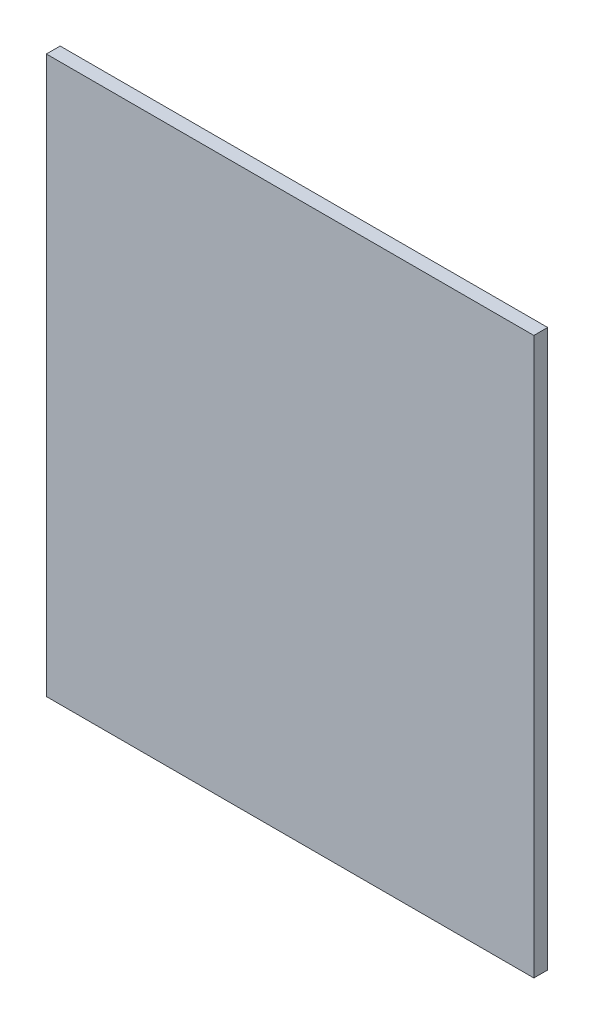
ISO-10303-21;
HEADER;
FILE_DESCRIPTION(('STEP AP214'),'2;1');
FILE_NAME('part.step','',(''),(''),'','','');
FILE_SCHEMA(('AUTOMOTIVE_DESIGN { 1 0 10303 214 1 1 1 1 }'));
ENDSEC;
DATA;
#1=APPLICATION_CONTEXT('core data for automotive mechanical design processes');
#2=APPLICATION_PROTOCOL_DEFINITION('international standard','automotive_design',2000,#1);
#3=PRODUCT_CONTEXT('',#1,'mechanical');
#4=PRODUCT('Part','Part','',(#3));
#5=PRODUCT_RELATED_PRODUCT_CATEGORY('part','',(#4));
#6=PRODUCT_DEFINITION_FORMATION('','',#4);
#7=PRODUCT_DEFINITION_CONTEXT('part definition',#1,'design');
#8=PRODUCT_DEFINITION('design','',#6,#7);
#9=PRODUCT_DEFINITION_SHAPE('','',#8);
#10=(LENGTH_UNIT() NAMED_UNIT(*) SI_UNIT(.MILLI.,.METRE.));
#11=(NAMED_UNIT(*) PLANE_ANGLE_UNIT() SI_UNIT($,.RADIAN.));
#12=(NAMED_UNIT(*) SI_UNIT($,.STERADIAN.) SOLID_ANGLE_UNIT());
#13=UNCERTAINTY_MEASURE_WITH_UNIT(LENGTH_MEASURE(1.E-05),#10,'distance_accuracy_value','');
#14=(GEOMETRIC_REPRESENTATION_CONTEXT(3) GLOBAL_UNCERTAINTY_ASSIGNED_CONTEXT((#13)) GLOBAL_UNIT_ASSIGNED_CONTEXT((#10,
#11,#12)) REPRESENTATION_CONTEXT('',''));
#15=CARTESIAN_POINT('',(0.,0.,0.));
#16=DIRECTION('',(0.,0.,1.));
#17=DIRECTION('',(1.,0.,0.));
#18=AXIS2_PLACEMENT_3D('',#15,#16,#17);
#19=CARTESIAN_POINT('',(0.,121.,3.));
#20=DIRECTION('',(1.,0.,0.));
#21=DIRECTION('',(0.,0.,-1.));
#22=AXIS2_PLACEMENT_3D('',#19,#20,#21);
#23=PLANE('',#22);
#24=DIRECTION('',(0.,-1.,0.));
#25=VECTOR('',#24,1.);
#26=CARTESIAN_POINT('',(0.,121.,0.));
#27=LINE('',#26,#25);
#28=CARTESIAN_POINT('',(0.,121.,0.));
#29=VERTEX_POINT('',#28);
#30=CARTESIAN_POINT('',(0.,0.,0.));
#31=VERTEX_POINT('',#30);
#32=EDGE_CURVE('E102',#29,#31,#27,.T.);
#33=ORIENTED_EDGE('',*,*,#32,.T.);
#34=DIRECTION('',(0.,0.,-1.));
#35=VECTOR('',#34,1.);
#36=CARTESIAN_POINT('',(0.,0.,3.));
#37=LINE('',#36,#35);
#38=CARTESIAN_POINT('',(0.,0.,3.));
#39=VERTEX_POINT('',#38);
#40=EDGE_CURVE('E11',#39,#31,#37,.T.);
#41=ORIENTED_EDGE('',*,*,#40,.F.);
#42=DIRECTION('',(0.,-1.,0.));
#43=VECTOR('',#42,1.);
#44=CARTESIAN_POINT('',(0.,121.,3.));
#45=LINE('',#44,#43);
#46=CARTESIAN_POINT('',(0.,121.,3.));
#47=VERTEX_POINT('',#46);
#48=EDGE_CURVE('E90',#47,#39,#45,.T.);
#49=ORIENTED_EDGE('',*,*,#48,.F.);
#50=DIRECTION('',(0.,0.,-1.));
#51=VECTOR('',#50,1.);
#52=CARTESIAN_POINT('',(0.,121.,3.));
#53=LINE('',#52,#51);
#54=EDGE_CURVE('E98',#47,#29,#53,.T.);
#55=ORIENTED_EDGE('',*,*,#54,.T.);
#56=EDGE_LOOP('',(#33,#41,#49,#55));
#57=FACE_BOUND('',#56,.T.);
#58=ADVANCED_FACE('F39',(#57),#23,.F.);
#59=CARTESIAN_POINT('',(0.,0.,3.));
#60=DIRECTION('',(0.,1.,0.));
#61=DIRECTION('',(0.,0.,1.));
#62=AXIS2_PLACEMENT_3D('',#59,#60,#61);
#63=PLANE('',#62);
#64=DIRECTION('',(1.,0.,0.));
#65=VECTOR('',#64,1.);
#66=CARTESIAN_POINT('',(0.,0.,0.));
#67=LINE('',#66,#65);
#68=CARTESIAN_POINT('',(106.,0.,0.));
#69=VERTEX_POINT('',#68);
#70=EDGE_CURVE('E94',#31,#69,#67,.T.);
#71=ORIENTED_EDGE('',*,*,#70,.T.);
#72=DIRECTION('',(0.,0.,-1.));
#73=VECTOR('',#72,1.);
#74=CARTESIAN_POINT('',(106.,0.,3.));
#75=LINE('',#74,#73);
#76=CARTESIAN_POINT('',(106.,0.,3.));
#77=VERTEX_POINT('',#76);
#78=EDGE_CURVE('E47',#77,#69,#75,.T.);
#79=ORIENTED_EDGE('',*,*,#78,.F.);
#80=DIRECTION('',(1.,0.,0.));
#81=VECTOR('',#80,1.);
#82=CARTESIAN_POINT('',(0.,0.,3.));
#83=LINE('',#82,#81);
#84=EDGE_CURVE('E85',#39,#77,#83,.T.);
#85=ORIENTED_EDGE('',*,*,#84,.F.);
#86=ORIENTED_EDGE('',*,*,#40,.T.);
#87=EDGE_LOOP('',(#71,#79,#85,#86));
#88=FACE_BOUND('',#87,.T.);
#89=ADVANCED_FACE('F93',(#88),#63,.F.);
#90=CARTESIAN_POINT('',(106.,0.,3.));
#91=DIRECTION('',(-1.,0.,0.));
#92=DIRECTION('',(0.,0.,1.));
#93=AXIS2_PLACEMENT_3D('',#90,#91,#92);
#94=PLANE('',#93);
#95=DIRECTION('',(0.,1.,0.));
#96=VECTOR('',#95,1.);
#97=CARTESIAN_POINT('',(106.,0.,0.));
#98=LINE('',#97,#96);
#99=CARTESIAN_POINT('',(106.,121.,0.));
#100=VERTEX_POINT('',#99);
#101=EDGE_CURVE('E72',#69,#100,#98,.T.);
#102=ORIENTED_EDGE('',*,*,#101,.T.);
#103=DIRECTION('',(0.,0.,-1.));
#104=VECTOR('',#103,1.);
#105=CARTESIAN_POINT('',(106.,121.,3.));
#106=LINE('',#105,#104);
#107=CARTESIAN_POINT('',(106.,121.,3.));
#108=VERTEX_POINT('',#107);
#109=EDGE_CURVE('E95',#108,#100,#106,.T.);
#110=ORIENTED_EDGE('',*,*,#109,.F.);
#111=DIRECTION('',(0.,1.,0.));
#112=VECTOR('',#111,1.);
#113=CARTESIAN_POINT('',(106.,0.,3.));
#114=LINE('',#113,#112);
#115=EDGE_CURVE('E88',#77,#108,#114,.T.);
#116=ORIENTED_EDGE('',*,*,#115,.F.);
#117=ORIENTED_EDGE('',*,*,#78,.T.);
#118=EDGE_LOOP('',(#102,#110,#116,#117));
#119=FACE_BOUND('',#118,.T.);
#120=ADVANCED_FACE('F96',(#119),#94,.F.);
#121=CARTESIAN_POINT('',(106.,121.,3.));
#122=DIRECTION('',(0.,-1.,0.));
#123=DIRECTION('',(0.,0.,-1.));
#124=AXIS2_PLACEMENT_3D('',#121,#122,#123);
#125=PLANE('',#124);
#126=DIRECTION('',(-1.,0.,0.));
#127=VECTOR('',#126,1.);
#128=CARTESIAN_POINT('',(106.,121.,0.));
#129=LINE('',#128,#127);
#130=EDGE_CURVE('E78',#100,#29,#129,.T.);
#131=ORIENTED_EDGE('',*,*,#130,.T.);
#132=ORIENTED_EDGE('',*,*,#54,.F.);
#133=DIRECTION('',(-1.,0.,0.));
#134=VECTOR('',#133,1.);
#135=CARTESIAN_POINT('',(106.,121.,3.));
#136=LINE('',#135,#134);
#137=EDGE_CURVE('E55',#108,#47,#136,.T.);
#138=ORIENTED_EDGE('',*,*,#137,.F.);
#139=ORIENTED_EDGE('',*,*,#109,.T.);
#140=EDGE_LOOP('',(#131,#132,#138,#139));
#141=FACE_BOUND('',#140,.T.);
#142=ADVANCED_FACE('F109',(#141),#125,.F.);
#143=CARTESIAN_POINT('',(0.,0.,3.));
#144=DIRECTION('',(0.,0.,1.));
#145=DIRECTION('',(1.,0.,0.));
#146=AXIS2_PLACEMENT_3D('',#143,#144,#145);
#147=PLANE('',#146);
#148=ORIENTED_EDGE('',*,*,#48,.T.);
#149=ORIENTED_EDGE('',*,*,#84,.T.);
#150=ORIENTED_EDGE('',*,*,#115,.T.);
#151=ORIENTED_EDGE('',*,*,#137,.T.);
#152=EDGE_LOOP('',(#148,#149,#150,#151));
#153=FACE_BOUND('',#152,.T.);
#154=ADVANCED_FACE('F86',(#153),#147,.T.);
#155=CARTESIAN_POINT('',(0.,0.,0.));
#156=DIRECTION('',(0.,0.,1.));
#157=DIRECTION('',(1.,0.,0.));
#158=AXIS2_PLACEMENT_3D('',#155,#156,#157);
#159=PLANE('',#158);
#160=ORIENTED_EDGE('',*,*,#32,.F.);
#161=ORIENTED_EDGE('',*,*,#130,.F.);
#162=ORIENTED_EDGE('',*,*,#101,.F.);
#163=ORIENTED_EDGE('',*,*,#70,.F.);
#164=EDGE_LOOP('',(#160,#161,#162,#163));
#165=FACE_BOUND('',#164,.T.);
#166=ADVANCED_FACE('F112',(#165),#159,.F.);
#167=CLOSED_SHELL('',(#58,#89,#120,#142,#154,#166));
#168=MANIFOLD_SOLID_BREP('B2',#167);
#169=ADVANCED_BREP_SHAPE_REPRESENTATION('',(#18,#168),#14);
#170=SHAPE_DEFINITION_REPRESENTATION(#9,#169);
ENDSEC;
END-ISO-10303-21;
